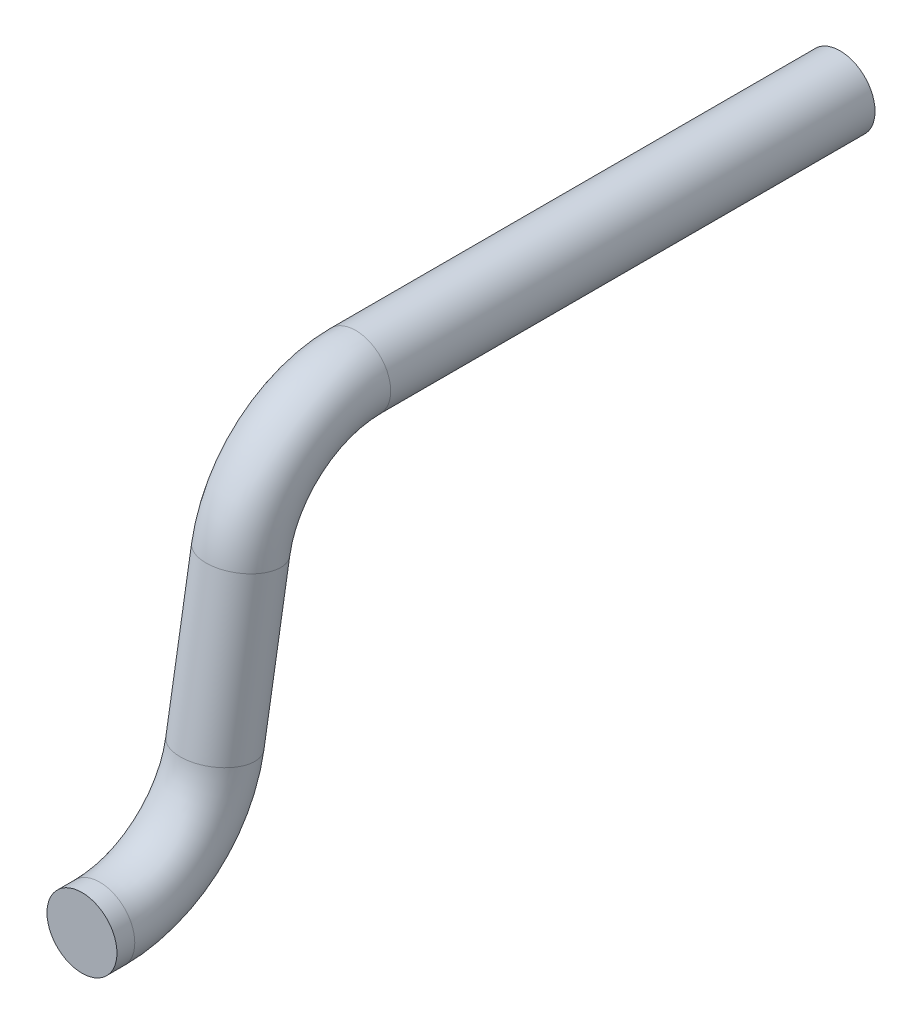
ISO-10303-21;
HEADER;
FILE_DESCRIPTION(('STEP AP214'),'2;1');
FILE_NAME('part.step','',(''),(''),'','','');
FILE_SCHEMA(('AUTOMOTIVE_DESIGN { 1 0 10303 214 1 1 1 1 }'));
ENDSEC;
DATA;
#1=APPLICATION_CONTEXT('core data for automotive mechanical design processes');
#2=APPLICATION_PROTOCOL_DEFINITION('international standard','automotive_design',2000,#1);
#3=PRODUCT_CONTEXT('',#1,'mechanical');
#4=PRODUCT('Part','Part','',(#3));
#5=PRODUCT_RELATED_PRODUCT_CATEGORY('part','',(#4));
#6=PRODUCT_DEFINITION_FORMATION('','',#4);
#7=PRODUCT_DEFINITION_CONTEXT('part definition',#1,'design');
#8=PRODUCT_DEFINITION('design','',#6,#7);
#9=PRODUCT_DEFINITION_SHAPE('','',#8);
#10=(LENGTH_UNIT() NAMED_UNIT(*) SI_UNIT(.MILLI.,.METRE.));
#11=(NAMED_UNIT(*) PLANE_ANGLE_UNIT() SI_UNIT($,.RADIAN.));
#12=(NAMED_UNIT(*) SI_UNIT($,.STERADIAN.) SOLID_ANGLE_UNIT());
#13=UNCERTAINTY_MEASURE_WITH_UNIT(LENGTH_MEASURE(1.E-05),#10,'distance_accuracy_value','');
#14=(GEOMETRIC_REPRESENTATION_CONTEXT(3) GLOBAL_UNCERTAINTY_ASSIGNED_CONTEXT((#13)) GLOBAL_UNIT_ASSIGNED_CONTEXT((#10,
#11,#12)) REPRESENTATION_CONTEXT('',''));
#15=CARTESIAN_POINT('',(0.,0.,0.));
#16=DIRECTION('',(0.,0.,1.));
#17=DIRECTION('',(1.,0.,0.));
#18=AXIS2_PLACEMENT_3D('',#15,#16,#17);
#19=CARTESIAN_POINT('',(3.75,0.,0.152872911616964));
#20=DIRECTION('',(0.,0.,-1.));
#21=DIRECTION('',(1.,0.,0.));
#22=AXIS2_PLACEMENT_3D('',#19,#20,#21);
#23=CYLINDRICAL_SURFACE('',#22,0.3);
#24=CARTESIAN_POINT('',(3.75,0.,-4.));
#25=DIRECTION('',(0.,0.,-1.));
#26=DIRECTION('',(1.,0.,0.));
#27=AXIS2_PLACEMENT_3D('',#24,#25,#26);
#28=CIRCLE('',#27,0.3);
#29=CARTESIAN_POINT('',(4.05,0.,-4.));
#30=VERTEX_POINT('',#29);
#31=CARTESIAN_POINT('',(3.45,0.,-4.));
#32=VERTEX_POINT('',#31);
#33=EDGE_CURVE('E11',#30,#32,#28,.T.);
#34=ORIENTED_EDGE('',*,*,#33,.F.);
#35=CARTESIAN_POINT('',(3.75,0.,-4.));
#36=DIRECTION('',(0.,0.,-1.));
#37=DIRECTION('',(1.,0.,0.));
#38=AXIS2_PLACEMENT_3D('',#35,#36,#37);
#39=CIRCLE('',#38,0.3);
#40=EDGE_CURVE('E24',#32,#30,#39,.T.);
#41=ORIENTED_EDGE('',*,*,#40,.F.);
#42=DIRECTION('',(0.,0.,1.));
#43=VECTOR('',#42,1.);
#44=CARTESIAN_POINT('',(3.45,0.,0.152872911616964));
#45=LINE('',#44,#43);
#46=CARTESIAN_POINT('',(3.45,0.,0.152872911616964));
#47=VERTEX_POINT('',#46);
#48=EDGE_CURVE('E125',#32,#47,#45,.T.);
#49=ORIENTED_EDGE('',*,*,#48,.T.);
#50=CARTESIAN_POINT('',(3.75,0.,0.152872911616964));
#51=DIRECTION('',(0.,0.,-1.));
#52=DIRECTION('',(1.,0.,0.));
#53=AXIS2_PLACEMENT_3D('',#50,#51,#52);
#54=CIRCLE('',#53,0.3);
#55=CARTESIAN_POINT('',(4.05,0.,0.152872911616965));
#56=VERTEX_POINT('',#55);
#57=EDGE_CURVE('E123',#47,#56,#54,.T.);
#58=ORIENTED_EDGE('',*,*,#57,.T.);
#59=CARTESIAN_POINT('',(3.75,0.,0.152872911616964));
#60=DIRECTION('',(0.,0.,-1.));
#61=DIRECTION('',(1.,0.,0.));
#62=AXIS2_PLACEMENT_3D('',#59,#60,#61);
#63=CIRCLE('',#62,0.3);
#64=CARTESIAN_POINT('',(3.75,-0.300000000000001,0.152872911616964));
#65=VERTEX_POINT('',#64);
#66=EDGE_CURVE('E121',#56,#65,#63,.T.);
#67=ORIENTED_EDGE('',*,*,#66,.T.);
#68=CARTESIAN_POINT('',(3.75,0.,0.152872911616964));
#69=DIRECTION('',(0.,0.,-1.));
#70=DIRECTION('',(1.,0.,0.));
#71=AXIS2_PLACEMENT_3D('',#68,#69,#70);
#72=CIRCLE('',#71,0.3);
#73=EDGE_CURVE('E118',#65,#47,#72,.T.);
#74=ORIENTED_EDGE('',*,*,#73,.T.);
#75=ORIENTED_EDGE('',*,*,#48,.F.);
#76=EDGE_LOOP('',(#34,#41,#49,#58,#67,#74,#75));
#77=FACE_BOUND('',#76,.T.);
#78=ADVANCED_FACE('F17',(#77),#23,.T.);
#79=CARTESIAN_POINT('',(3.75,-0.999999999999999,0.152872911616964));
#80=DIRECTION('',(-1.,0.,0.));
#81=DIRECTION('',(0.,0.,1.));
#82=AXIS2_PLACEMENT_3D('',#79,#80,#81);
#83=TOROIDAL_SURFACE('',#82,0.999999999999999,0.3);
#84=ORIENTED_EDGE('',*,*,#66,.F.);
#85=ORIENTED_EDGE('',*,*,#57,.F.);
#86=ORIENTED_EDGE('',*,*,#73,.F.);
#87=CARTESIAN_POINT('',(3.75,-0.999999999999999,0.152872911616964));
#88=DIRECTION('',(1.,0.,0.));
#89=DIRECTION('',(0.,0.,1.));
#90=AXIS2_PLACEMENT_3D('',#87,#88,#89);
#91=CIRCLE('',#90,0.699999999999998);
#92=CARTESIAN_POINT('',(3.75,-0.884920708886249,0.843348658299463));
#93=VERTEX_POINT('',#92);
#94=EDGE_CURVE('E116',#65,#93,#91,.T.);
#95=ORIENTED_EDGE('',*,*,#94,.T.);
#96=CARTESIAN_POINT('',(3.75,-0.835601012694642,1.1392668354491));
#97=DIRECTION('',(0.,0.986393923832144,-0.164398987305357));
#98=DIRECTION('',(1.,0.,0.));
#99=AXIS2_PLACEMENT_3D('',#96,#97,#98);
#100=CIRCLE('',#99,0.3);
#101=CARTESIAN_POINT('',(3.45,-0.835601012694642,1.1392668354491));
#102=VERTEX_POINT('',#101);
#103=EDGE_CURVE('E114',#93,#102,#100,.T.);
#104=ORIENTED_EDGE('',*,*,#103,.T.);
#105=CARTESIAN_POINT('',(3.75,-0.835601012694642,1.1392668354491));
#106=DIRECTION('',(0.,0.986393923832144,-0.164398987305357));
#107=DIRECTION('',(1.,0.,0.));
#108=AXIS2_PLACEMENT_3D('',#105,#106,#107);
#109=CIRCLE('',#108,0.3);
#110=CARTESIAN_POINT('',(4.05,-0.835601012694643,1.1392668354491));
#111=VERTEX_POINT('',#110);
#112=EDGE_CURVE('E112',#102,#111,#109,.T.);
#113=ORIENTED_EDGE('',*,*,#112,.T.);
#114=CARTESIAN_POINT('',(3.75,-0.835601012694642,1.1392668354491));
#115=DIRECTION('',(0.,0.986393923832144,-0.164398987305357));
#116=DIRECTION('',(1.,0.,0.));
#117=AXIS2_PLACEMENT_3D('',#114,#115,#116);
#118=CIRCLE('',#117,0.3);
#119=EDGE_CURVE('E109',#111,#93,#118,.T.);
#120=ORIENTED_EDGE('',*,*,#119,.T.);
#121=ORIENTED_EDGE('',*,*,#94,.F.);
#122=EDGE_LOOP('',(#84,#85,#86,#95,#104,#113,#120,#121));
#123=FACE_BOUND('',#122,.T.);
#124=ADVANCED_FACE('F132',(#123),#83,.T.);
#125=CARTESIAN_POINT('',(3.75,-2.1643989873054,1.3607331645509));
#126=DIRECTION('',(0.,0.986393923832144,-0.164398987305357));
#127=DIRECTION('',(1.,0.,0.));
#128=AXIS2_PLACEMENT_3D('',#125,#126,#127);
#129=CYLINDRICAL_SURFACE('',#128,0.3);
#130=ORIENTED_EDGE('',*,*,#119,.F.);
#131=ORIENTED_EDGE('',*,*,#112,.F.);
#132=DIRECTION('',(0.,-0.986393923832144,0.164398987305357));
#133=VECTOR('',#132,1.);
#134=CARTESIAN_POINT('',(3.45,-2.1643989873054,1.3607331645509));
#135=LINE('',#134,#133);
#136=CARTESIAN_POINT('',(3.45,-2.1643989873054,1.3607331645509));
#137=VERTEX_POINT('',#136);
#138=EDGE_CURVE('E107',#102,#137,#135,.T.);
#139=ORIENTED_EDGE('',*,*,#138,.T.);
#140=CARTESIAN_POINT('',(3.75,-2.1643989873054,1.3607331645509));
#141=DIRECTION('',(0.,0.986393923832144,-0.164398987305357));
#142=DIRECTION('',(1.,0.,0.));
#143=AXIS2_PLACEMENT_3D('',#140,#141,#142);
#144=CIRCLE('',#143,0.3);
#145=CARTESIAN_POINT('',(3.75,-2.1150792911138,1.6566513417005));
#146=VERTEX_POINT('',#145);
#147=EDGE_CURVE('E105',#137,#146,#144,.T.);
#148=ORIENTED_EDGE('',*,*,#147,.T.);
#149=CARTESIAN_POINT('',(3.75,-2.1643989873054,1.3607331645509));
#150=DIRECTION('',(0.,0.986393923832144,-0.164398987305357));
#151=DIRECTION('',(1.,0.,0.));
#152=AXIS2_PLACEMENT_3D('',#149,#150,#151);
#153=CIRCLE('',#152,0.3);
#154=CARTESIAN_POINT('',(4.05,-2.1643989873054,1.3607331645509));
#155=VERTEX_POINT('',#154);
#156=EDGE_CURVE('E103',#146,#155,#153,.T.);
#157=ORIENTED_EDGE('',*,*,#156,.T.);
#158=CARTESIAN_POINT('',(3.75,-2.1643989873054,1.3607331645509));
#159=DIRECTION('',(0.,0.986393923832144,-0.164398987305357));
#160=DIRECTION('',(1.,0.,0.));
#161=AXIS2_PLACEMENT_3D('',#158,#159,#160);
#162=CIRCLE('',#161,0.3);
#163=EDGE_CURVE('E100',#155,#137,#162,.T.);
#164=ORIENTED_EDGE('',*,*,#163,.T.);
#165=ORIENTED_EDGE('',*,*,#138,.F.);
#166=ORIENTED_EDGE('',*,*,#103,.F.);
#167=EDGE_LOOP('',(#130,#131,#139,#148,#157,#164,#165,#166));
#168=FACE_BOUND('',#167,.T.);
#169=ADVANCED_FACE('F137',(#168),#129,.T.);
#170=CARTESIAN_POINT('',(3.75,-2.,2.347127088383));
#171=DIRECTION('',(1.,0.,0.));
#172=DIRECTION('',(0.,0.,-1.));
#173=AXIS2_PLACEMENT_3D('',#170,#171,#172);
#174=TOROIDAL_SURFACE('',#173,1.,0.3);
#175=ORIENTED_EDGE('',*,*,#163,.F.);
#176=ORIENTED_EDGE('',*,*,#156,.F.);
#177=CARTESIAN_POINT('',(3.75,-2.,2.347127088383));
#178=DIRECTION('',(-1.,0.,0.));
#179=DIRECTION('',(0.,0.,-1.));
#180=AXIS2_PLACEMENT_3D('',#177,#178,#179);
#181=CIRCLE('',#180,0.7);
#182=CARTESIAN_POINT('',(3.75,-2.7,2.347127088383));
#183=VERTEX_POINT('',#182);
#184=EDGE_CURVE('E98',#146,#183,#181,.T.);
#185=ORIENTED_EDGE('',*,*,#184,.T.);
#186=CARTESIAN_POINT('',(3.75,-3.,2.347127088383));
#187=DIRECTION('',(0.,0.,-1.));
#188=DIRECTION('',(1.,0.,0.));
#189=AXIS2_PLACEMENT_3D('',#186,#187,#188);
#190=CIRCLE('',#189,0.3);
#191=CARTESIAN_POINT('',(4.05,-3.,2.347127088383));
#192=VERTEX_POINT('',#191);
#193=EDGE_CURVE('E96',#183,#192,#190,.T.);
#194=ORIENTED_EDGE('',*,*,#193,.T.);
#195=CARTESIAN_POINT('',(3.75,-3.,2.347127088383));
#196=DIRECTION('',(0.,0.,-1.));
#197=DIRECTION('',(1.,0.,0.));
#198=AXIS2_PLACEMENT_3D('',#195,#196,#197);
#199=CIRCLE('',#198,0.3);
#200=CARTESIAN_POINT('',(3.45,-3.,2.347127088383));
#201=VERTEX_POINT('',#200);
#202=EDGE_CURVE('E94',#192,#201,#199,.T.);
#203=ORIENTED_EDGE('',*,*,#202,.T.);
#204=CARTESIAN_POINT('',(3.75,-3.,2.347127088383));
#205=DIRECTION('',(0.,0.,-1.));
#206=DIRECTION('',(1.,0.,0.));
#207=AXIS2_PLACEMENT_3D('',#204,#205,#206);
#208=CIRCLE('',#207,0.3);
#209=EDGE_CURVE('E91',#201,#183,#208,.T.);
#210=ORIENTED_EDGE('',*,*,#209,.T.);
#211=ORIENTED_EDGE('',*,*,#184,.F.);
#212=ORIENTED_EDGE('',*,*,#147,.F.);
#213=EDGE_LOOP('',(#175,#176,#185,#194,#203,#210,#211,#212));
#214=FACE_BOUND('',#213,.T.);
#215=ADVANCED_FACE('F144',(#214),#174,.T.);
#216=CARTESIAN_POINT('',(3.75,-3.,2.5));
#217=DIRECTION('',(0.,0.,-1.));
#218=DIRECTION('',(1.,0.,0.));
#219=AXIS2_PLACEMENT_3D('',#216,#217,#218);
#220=CYLINDRICAL_SURFACE('',#219,0.3);
#221=ORIENTED_EDGE('',*,*,#202,.F.);
#222=ORIENTED_EDGE('',*,*,#193,.F.);
#223=ORIENTED_EDGE('',*,*,#209,.F.);
#224=DIRECTION('',(0.,0.,1.));
#225=VECTOR('',#224,1.);
#226=CARTESIAN_POINT('',(3.45,-3.,2.5));
#227=LINE('',#226,#225);
#228=CARTESIAN_POINT('',(3.45,-3.,2.5));
#229=VERTEX_POINT('',#228);
#230=EDGE_CURVE('E84',#201,#229,#227,.T.);
#231=ORIENTED_EDGE('',*,*,#230,.T.);
#232=CARTESIAN_POINT('',(3.75,-3.,2.5));
#233=DIRECTION('',(0.,0.,1.));
#234=DIRECTION('',(1.,0.,0.));
#235=AXIS2_PLACEMENT_3D('',#232,#233,#234);
#236=CIRCLE('',#235,0.3);
#237=CARTESIAN_POINT('',(4.05,-3.,2.5));
#238=VERTEX_POINT('',#237);
#239=EDGE_CURVE('E77',#238,#229,#236,.T.);
#240=ORIENTED_EDGE('',*,*,#239,.F.);
#241=CARTESIAN_POINT('',(3.75,-3.,2.5));
#242=DIRECTION('',(0.,0.,1.));
#243=DIRECTION('',(1.,0.,0.));
#244=AXIS2_PLACEMENT_3D('',#241,#242,#243);
#245=CIRCLE('',#244,0.3);
#246=EDGE_CURVE('E82',#229,#238,#245,.T.);
#247=ORIENTED_EDGE('',*,*,#246,.F.);
#248=ORIENTED_EDGE('',*,*,#230,.F.);
#249=EDGE_LOOP('',(#221,#222,#223,#231,#240,#247,#248));
#250=FACE_BOUND('',#249,.T.);
#251=ADVANCED_FACE('F80',(#250),#220,.T.);
#252=CARTESIAN_POINT('',(3.75,0.,-4.));
#253=DIRECTION('',(0.,0.,1.));
#254=DIRECTION('',(1.,0.,0.));
#255=AXIS2_PLACEMENT_3D('',#252,#253,#254);
#256=PLANE('',#255);
#257=ORIENTED_EDGE('',*,*,#33,.T.);
#258=ORIENTED_EDGE('',*,*,#40,.T.);
#259=EDGE_LOOP('',(#257,#258));
#260=FACE_BOUND('',#259,.T.);
#261=ADVANCED_FACE('F126',(#260),#256,.F.);
#262=CARTESIAN_POINT('',(3.75,-3.,2.5));
#263=DIRECTION('',(0.,0.,1.));
#264=DIRECTION('',(1.,0.,0.));
#265=AXIS2_PLACEMENT_3D('',#262,#263,#264);
#266=PLANE('',#265);
#267=ORIENTED_EDGE('',*,*,#239,.T.);
#268=ORIENTED_EDGE('',*,*,#246,.T.);
#269=EDGE_LOOP('',(#267,#268));
#270=FACE_BOUND('',#269,.T.);
#271=ADVANCED_FACE('F87',(#270),#266,.T.);
#272=CLOSED_SHELL('',(#78,#124,#169,#215,#251,#261,#271));
#273=MANIFOLD_SOLID_BREP('B1',#272);
#274=ADVANCED_BREP_SHAPE_REPRESENTATION('',(#18,#273),#14);
#275=SHAPE_DEFINITION_REPRESENTATION(#9,#274);
ENDSEC;
END-ISO-10303-21;
